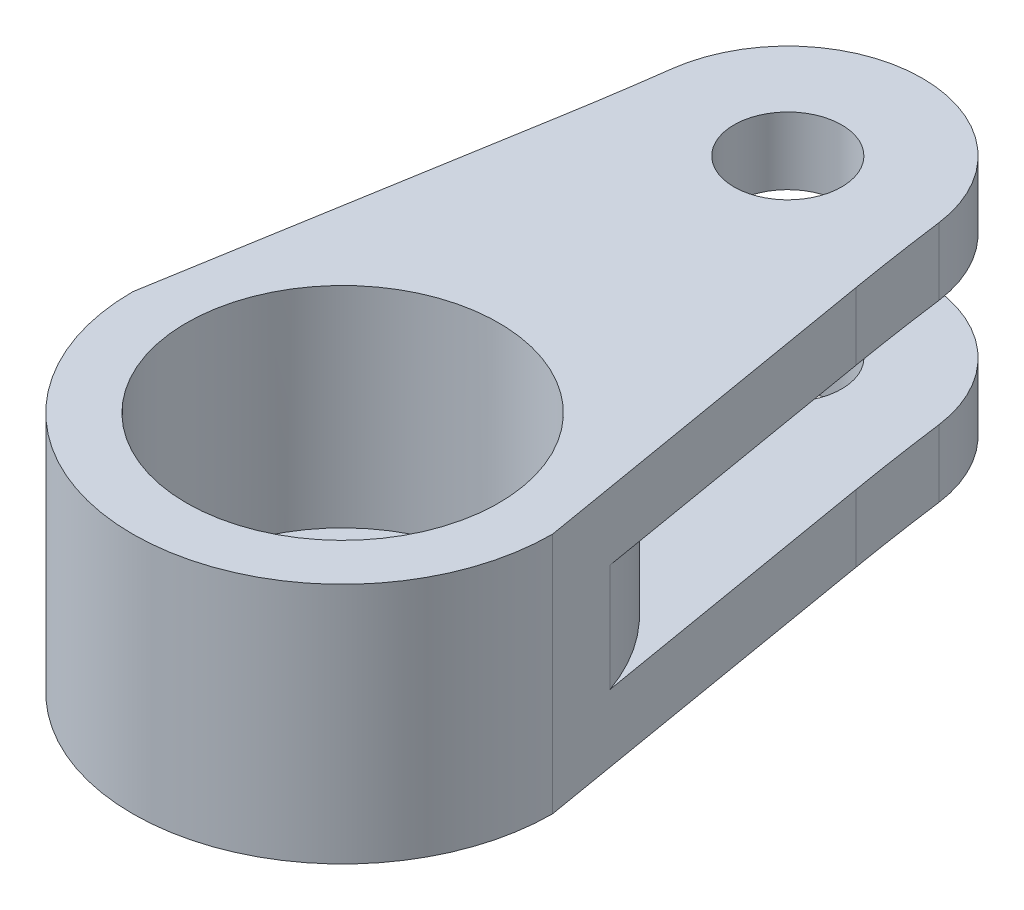
ISO-10303-21;
HEADER;
FILE_DESCRIPTION(('STEP AP214'),'2;1');
FILE_NAME('part.step','',(''),(''),'','','');
FILE_SCHEMA(('AUTOMOTIVE_DESIGN { 1 0 10303 214 1 1 1 1 }'));
ENDSEC;
DATA;
#1=APPLICATION_CONTEXT('core data for automotive mechanical design processes');
#2=APPLICATION_PROTOCOL_DEFINITION('international standard','automotive_design',2000,#1);
#3=PRODUCT_CONTEXT('',#1,'mechanical');
#4=PRODUCT('Part','Part','',(#3));
#5=PRODUCT_RELATED_PRODUCT_CATEGORY('part','',(#4));
#6=PRODUCT_DEFINITION_FORMATION('','',#4);
#7=PRODUCT_DEFINITION_CONTEXT('part definition',#1,'design');
#8=PRODUCT_DEFINITION('design','',#6,#7);
#9=PRODUCT_DEFINITION_SHAPE('','',#8);
#10=(LENGTH_UNIT() NAMED_UNIT(*) SI_UNIT(.MILLI.,.METRE.));
#11=(NAMED_UNIT(*) PLANE_ANGLE_UNIT() SI_UNIT($,.RADIAN.));
#12=(NAMED_UNIT(*) SI_UNIT($,.STERADIAN.) SOLID_ANGLE_UNIT());
#13=UNCERTAINTY_MEASURE_WITH_UNIT(LENGTH_MEASURE(1.E-05),#10,'distance_accuracy_value','');
#14=(GEOMETRIC_REPRESENTATION_CONTEXT(3) GLOBAL_UNCERTAINTY_ASSIGNED_CONTEXT((#13)) GLOBAL_UNIT_ASSIGNED_CONTEXT((#10,
#11,#12)) REPRESENTATION_CONTEXT('',''));
#15=CARTESIAN_POINT('',(0.,0.,0.));
#16=DIRECTION('',(0.,0.,1.));
#17=DIRECTION('',(1.,0.,0.));
#18=AXIS2_PLACEMENT_3D('',#15,#16,#17);
#19=CARTESIAN_POINT('',(0.,0.,0.));
#20=DIRECTION('',(0.,1.,0.));
#21=DIRECTION('',(0.,0.,1.));
#22=AXIS2_PLACEMENT_3D('',#19,#20,#21);
#23=CYLINDRICAL_SURFACE('',#22,2.9);
#24=CARTESIAN_POINT('',(0.,4.5,0.));
#25=DIRECTION('',(0.,1.,0.));
#26=DIRECTION('',(0.,0.,1.));
#27=AXIS2_PLACEMENT_3D('',#24,#25,#26);
#28=CIRCLE('',#27,2.9);
#29=CARTESIAN_POINT('',(0.,4.5,2.9));
#30=VERTEX_POINT('',#29);
#31=EDGE_CURVE('E196',#30,#30,#28,.T.);
#32=ORIENTED_EDGE('',*,*,#31,.T.);
#33=EDGE_LOOP('',(#32));
#34=FACE_BOUND('',#33,.T.);
#35=CARTESIAN_POINT('',(0.,0.6,0.));
#36=DIRECTION('',(0.,-1.,0.));
#37=DIRECTION('',(0.,0.,-1.));
#38=AXIS2_PLACEMENT_3D('',#35,#36,#37);
#39=CIRCLE('',#38,2.9);
#40=CARTESIAN_POINT('',(0.,0.6,-2.9));
#41=VERTEX_POINT('',#40);
#42=EDGE_CURVE('E11',#41,#41,#39,.F.);
#43=ORIENTED_EDGE('',*,*,#42,.F.);
#44=EDGE_LOOP('',(#43));
#45=FACE_BOUND('',#44,.T.);
#46=ADVANCED_FACE('F43',(#34,#45),#23,.F.);
#47=CARTESIAN_POINT('',(2.5,4.5,-8.27));
#48=DIRECTION('',(-0.985971831200907,0.,0.166911797301242));
#49=DIRECTION('',(0.166911797301242,0.,0.985971831200907));
#50=AXIS2_PLACEMENT_3D('',#47,#48,#49);
#51=PLANE('',#50);
#52=DIRECTION('',(-0.166911797301242,0.,-0.985971831200907));
#53=VECTOR('',#52,1.);
#54=CARTESIAN_POINT('',(3.68269552498902,1.25,-1.28364857738629));
#55=LINE('',#54,#53);
#56=CARTESIAN_POINT('',(3.68269552498902,1.25,-1.28364857738629));
#57=VERTEX_POINT('',#56);
#58=CARTESIAN_POINT('',(2.75059412488278,1.25,-6.7897047051567));
#59=VERTEX_POINT('',#58);
#60=EDGE_CURVE('E148',#57,#59,#55,.T.);
#61=ORIENTED_EDGE('',*,*,#60,.F.);
#62=DIRECTION('',(0.,1.,0.));
#63=VECTOR('',#62,1.);
#64=CARTESIAN_POINT('',(3.68269552498902,1.25,-1.28364857738629));
#65=LINE('',#64,#63);
#66=CARTESIAN_POINT('',(3.68269552498902,3.25,-1.28364857738629));
#67=VERTEX_POINT('',#66);
#68=EDGE_CURVE('E134',#57,#67,#65,.T.);
#69=ORIENTED_EDGE('',*,*,#68,.T.);
#70=DIRECTION('',(-0.166911797301242,0.,-0.985971831200907));
#71=VECTOR('',#70,1.);
#72=CARTESIAN_POINT('',(3.68269552498902,3.25,-1.28364857738629));
#73=LINE('',#72,#71);
#74=CARTESIAN_POINT('',(2.75059412488278,3.25,-6.7897047051567));
#75=VERTEX_POINT('',#74);
#76=EDGE_CURVE('E177',#67,#75,#73,.T.);
#77=ORIENTED_EDGE('',*,*,#76,.T.);
#78=DIRECTION('',(0.,1.,0.));
#79=VECTOR('',#78,1.);
#80=CARTESIAN_POINT('',(2.75059412488278,4.5,-6.78970470515671));
#81=LINE('',#80,#79);
#82=CARTESIAN_POINT('',(2.75059412488278,4.5,-6.78970470515671));
#83=VERTEX_POINT('',#82);
#84=EDGE_CURVE('E67',#75,#83,#81,.T.);
#85=ORIENTED_EDGE('',*,*,#84,.T.);
#86=DIRECTION('',(-0.166911797301242,0.,-0.985971831200907));
#87=VECTOR('',#86,1.);
#88=CARTESIAN_POINT('',(2.5,4.5,-8.27));
#89=LINE('',#88,#87);
#90=CARTESIAN_POINT('',(3.9,4.5,0.));
#91=VERTEX_POINT('',#90);
#92=EDGE_CURVE('E212',#91,#83,#89,.T.);
#93=ORIENTED_EDGE('',*,*,#92,.F.);
#94=DIRECTION('',(0.,-1.,0.));
#95=VECTOR('',#94,1.);
#96=CARTESIAN_POINT('',(3.9,4.5,0.));
#97=LINE('',#96,#95);
#98=CARTESIAN_POINT('',(3.9,0.,0.));
#99=VERTEX_POINT('',#98);
#100=EDGE_CURVE('E239',#91,#99,#97,.T.);
#101=ORIENTED_EDGE('',*,*,#100,.T.);
#102=DIRECTION('',(-0.166911797301242,0.,-0.985971831200907));
#103=VECTOR('',#102,1.);
#104=CARTESIAN_POINT('',(2.5,0.,-8.27));
#105=LINE('',#104,#103);
#106=CARTESIAN_POINT('',(2.75059412488278,0.,-6.78970470515671));
#107=VERTEX_POINT('',#106);
#108=EDGE_CURVE('E227',#99,#107,#105,.T.);
#109=ORIENTED_EDGE('',*,*,#108,.T.);
#110=EDGE_CURVE('E159',#107,#59,#81,.T.);
#111=ORIENTED_EDGE('',*,*,#110,.T.);
#112=EDGE_LOOP('',(#61,#69,#77,#85,#93,#101,#109,#111));
#113=FACE_BOUND('',#112,.T.);
#114=ADVANCED_FACE('F156',(#113),#51,.F.);
#115=CARTESIAN_POINT('',(0.,4.5,-8.27));
#116=DIRECTION('',(0.,-1.,0.));
#117=DIRECTION('',(0.,0.,-1.));
#118=AXIS2_PLACEMENT_3D('',#115,#116,#117);
#119=CYLINDRICAL_SURFACE('',#118,2.5);
#120=CARTESIAN_POINT('',(0.,1.25,-8.27));
#121=DIRECTION('',(0.,1.,0.));
#122=DIRECTION('',(0.,0.,1.));
#123=AXIS2_PLACEMENT_3D('',#120,#121,#122);
#124=CIRCLE('',#123,2.5);
#125=CARTESIAN_POINT('',(2.47853265166325,1.25,-8.59691878905806));
#126=VERTEX_POINT('',#125);
#127=CARTESIAN_POINT('',(-2.47853265166324,1.25,-8.59691878905804));
#128=VERTEX_POINT('',#127);
#129=EDGE_CURVE('E164',#126,#128,#124,.T.);
#130=ORIENTED_EDGE('',*,*,#129,.F.);
#131=DIRECTION('',(0.,-1.,0.));
#132=VECTOR('',#131,1.);
#133=CARTESIAN_POINT('',(2.47853265166324,4.5,-8.59691878905804));
#134=LINE('',#133,#132);
#135=CARTESIAN_POINT('',(2.47853265166324,0.,-8.59691878905804));
#136=VERTEX_POINT('',#135);
#137=EDGE_CURVE('E248',#126,#136,#134,.T.);
#138=ORIENTED_EDGE('',*,*,#137,.T.);
#139=CARTESIAN_POINT('',(0.,0.,-8.27));
#140=DIRECTION('',(0.,1.,0.));
#141=DIRECTION('',(0.,0.,1.));
#142=AXIS2_PLACEMENT_3D('',#139,#140,#141);
#143=CIRCLE('',#142,2.5);
#144=CARTESIAN_POINT('',(-2.47853265166324,0.,-8.59691878905804));
#145=VERTEX_POINT('',#144);
#146=EDGE_CURVE('E230',#136,#145,#143,.T.);
#147=ORIENTED_EDGE('',*,*,#146,.T.);
#148=DIRECTION('',(0.,-1.,0.));
#149=VECTOR('',#148,1.);
#150=CARTESIAN_POINT('',(-2.47853265166324,4.5,-8.59691878905804));
#151=LINE('',#150,#149);
#152=EDGE_CURVE('E254',#145,#128,#151,.F.);
#153=ORIENTED_EDGE('',*,*,#152,.T.);
#154=EDGE_LOOP('',(#130,#138,#147,#153));
#155=FACE_BOUND('',#154,.T.);
#156=ADVANCED_FACE('F313',(#155),#119,.T.);
#157=CARTESIAN_POINT('',(-3.9,4.5,0.));
#158=DIRECTION('',(0.985971831200907,0.,0.166911797301242));
#159=DIRECTION('',(0.166911797301242,0.,-0.985971831200907));
#160=AXIS2_PLACEMENT_3D('',#157,#158,#159);
#161=PLANE('',#160);
#162=DIRECTION('',(-0.166911797301243,0.,0.985971831200906));
#163=VECTOR('',#162,1.);
#164=CARTESIAN_POINT('',(-2.75059412488278,1.25,-6.78970470515668));
#165=LINE('',#164,#163);
#166=CARTESIAN_POINT('',(-2.75059412488278,1.25,-6.78970470515668));
#167=VERTEX_POINT('',#166);
#168=CARTESIAN_POINT('',(-3.68269552498902,1.25,-1.28364857738629));
#169=VERTEX_POINT('',#168);
#170=EDGE_CURVE('E144',#167,#169,#165,.T.);
#171=ORIENTED_EDGE('',*,*,#170,.F.);
#172=DIRECTION('',(0.,1.,0.));
#173=VECTOR('',#172,1.);
#174=CARTESIAN_POINT('',(-2.75059412488278,0.,-6.78970470515671));
#175=LINE('',#174,#173);
#176=CARTESIAN_POINT('',(-2.75059412488278,0.,-6.78970470515671));
#177=VERTEX_POINT('',#176);
#178=EDGE_CURVE('E243',#167,#177,#175,.F.);
#179=ORIENTED_EDGE('',*,*,#178,.T.);
#180=DIRECTION('',(-0.166911797301242,0.,0.985971831200907));
#181=VECTOR('',#180,1.);
#182=CARTESIAN_POINT('',(-3.9,0.,0.));
#183=LINE('',#182,#181);
#184=CARTESIAN_POINT('',(-3.9,0.,0.));
#185=VERTEX_POINT('',#184);
#186=EDGE_CURVE('E213',#177,#185,#183,.T.);
#187=ORIENTED_EDGE('',*,*,#186,.T.);
#188=DIRECTION('',(0.,-1.,0.));
#189=VECTOR('',#188,1.);
#190=CARTESIAN_POINT('',(-3.9,4.5,0.));
#191=LINE('',#190,#189);
#192=CARTESIAN_POINT('',(-3.9,4.5,0.));
#193=VERTEX_POINT('',#192);
#194=EDGE_CURVE('E223',#193,#185,#191,.T.);
#195=ORIENTED_EDGE('',*,*,#194,.F.);
#196=DIRECTION('',(-0.166911797301242,0.,0.985971831200907));
#197=VECTOR('',#196,1.);
#198=CARTESIAN_POINT('',(-3.9,4.5,0.));
#199=LINE('',#198,#197);
#200=CARTESIAN_POINT('',(-2.75059412488278,4.5,-6.78970470515671));
#201=VERTEX_POINT('',#200);
#202=EDGE_CURVE('E220',#201,#193,#199,.T.);
#203=ORIENTED_EDGE('',*,*,#202,.F.);
#204=CARTESIAN_POINT('',(-2.75059412488278,3.25,-6.78970470515668));
#205=VERTEX_POINT('',#204);
#206=EDGE_CURVE('E244',#201,#205,#175,.F.);
#207=ORIENTED_EDGE('',*,*,#206,.T.);
#208=DIRECTION('',(-0.166911797301243,0.,0.985971831200906));
#209=VECTOR('',#208,1.);
#210=CARTESIAN_POINT('',(-2.75059412488278,3.25,-6.78970470515668));
#211=LINE('',#210,#209);
#212=CARTESIAN_POINT('',(-3.68269552498902,3.25,-1.28364857738629));
#213=VERTEX_POINT('',#212);
#214=EDGE_CURVE('E153',#205,#213,#211,.T.);
#215=ORIENTED_EDGE('',*,*,#214,.T.);
#216=DIRECTION('',(0.,1.,0.));
#217=VECTOR('',#216,1.);
#218=CARTESIAN_POINT('',(-3.68269552498902,1.25,-1.28364857738629));
#219=LINE('',#218,#217);
#220=EDGE_CURVE('E143',#169,#213,#219,.T.);
#221=ORIENTED_EDGE('',*,*,#220,.F.);
#222=EDGE_LOOP('',(#171,#179,#187,#195,#203,#207,#215,#221));
#223=FACE_BOUND('',#222,.T.);
#224=ADVANCED_FACE('F281',(#223),#161,.F.);
#225=CARTESIAN_POINT('',(0.,0.,-8.27));
#226=DIRECTION('',(0.,1.,0.));
#227=DIRECTION('',(0.,0.,1.));
#228=AXIS2_PLACEMENT_3D('',#225,#226,#227);
#229=CYLINDRICAL_SURFACE('',#228,1.);
#230=CARTESIAN_POINT('',(0.,0.,-8.27));
#231=DIRECTION('',(0.,1.,0.));
#232=DIRECTION('',(0.,0.,1.));
#233=AXIS2_PLACEMENT_3D('',#230,#231,#232);
#234=CIRCLE('',#233,1.);
#235=CARTESIAN_POINT('',(0.,0.,-7.27));
#236=VERTEX_POINT('',#235);
#237=EDGE_CURVE('E194',#236,#236,#234,.T.);
#238=ORIENTED_EDGE('',*,*,#237,.F.);
#239=EDGE_LOOP('',(#238));
#240=FACE_BOUND('',#239,.T.);
#241=CARTESIAN_POINT('',(0.,1.25,-8.27));
#242=DIRECTION('',(0.,1.,0.));
#243=DIRECTION('',(0.,0.,1.));
#244=AXIS2_PLACEMENT_3D('',#241,#242,#243);
#245=CIRCLE('',#244,1.);
#246=CARTESIAN_POINT('',(0.,1.25,-7.27));
#247=VERTEX_POINT('',#246);
#248=EDGE_CURVE('E178',#247,#247,#245,.T.);
#249=ORIENTED_EDGE('',*,*,#248,.T.);
#250=EDGE_LOOP('',(#249));
#251=FACE_BOUND('',#250,.T.);
#252=ADVANCED_FACE('F320',(#240,#251),#229,.F.);
#253=CARTESIAN_POINT('',(-52.0491856849281,4.5,-15.1352945702188));
#254=DIRECTION('',(0.,-1.,0.));
#255=DIRECTION('',(0.,0.,-1.));
#256=AXIS2_PLACEMENT_3D('',#253,#254,#255);
#257=CYLINDRICAL_SURFACE('',#256,50.);
#258=CARTESIAN_POINT('',(-52.0491856849281,1.25,-15.1352945702188));
#259=DIRECTION('',(0.,-1.,0.));
#260=DIRECTION('',(0.,0.,1.));
#261=AXIS2_PLACEMENT_3D('',#258,#259,#260);
#262=CIRCLE('',#261,50.);
#263=EDGE_CURVE('E170',#128,#167,#262,.T.);
#264=ORIENTED_EDGE('',*,*,#263,.F.);
#265=ORIENTED_EDGE('',*,*,#152,.F.);
#266=CARTESIAN_POINT('',(-52.0491856849281,0.,-15.1352945702188));
#267=DIRECTION('',(0.,1.,0.));
#268=DIRECTION('',(0.,0.,1.));
#269=AXIS2_PLACEMENT_3D('',#266,#267,#268);
#270=CIRCLE('',#269,50.);
#271=EDGE_CURVE('E260',#177,#145,#270,.T.);
#272=ORIENTED_EDGE('',*,*,#271,.F.);
#273=ORIENTED_EDGE('',*,*,#178,.F.);
#274=EDGE_LOOP('',(#264,#265,#272,#273));
#275=FACE_BOUND('',#274,.T.);
#276=ADVANCED_FACE('F297',(#275),#257,.F.);
#277=CARTESIAN_POINT('',(52.0491856849281,4.5,-15.1352945702188));
#278=DIRECTION('',(0.,-1.,0.));
#279=DIRECTION('',(0.,0.,-1.));
#280=AXIS2_PLACEMENT_3D('',#277,#278,#279);
#281=CYLINDRICAL_SURFACE('',#280,50.);
#282=CARTESIAN_POINT('',(52.0491856849281,1.25,-15.1352945702188));
#283=DIRECTION('',(0.,-1.,0.));
#284=DIRECTION('',(0.,0.,1.));
#285=AXIS2_PLACEMENT_3D('',#282,#283,#284);
#286=CIRCLE('',#285,50.);
#287=EDGE_CURVE('E161',#59,#126,#286,.T.);
#288=ORIENTED_EDGE('',*,*,#287,.F.);
#289=ORIENTED_EDGE('',*,*,#110,.F.);
#290=CARTESIAN_POINT('',(52.0491856849281,0.,-15.1352945702188));
#291=DIRECTION('',(0.,1.,0.));
#292=DIRECTION('',(0.,0.,1.));
#293=AXIS2_PLACEMENT_3D('',#290,#291,#292);
#294=CIRCLE('',#293,50.);
#295=EDGE_CURVE('E266',#136,#107,#294,.T.);
#296=ORIENTED_EDGE('',*,*,#295,.F.);
#297=ORIENTED_EDGE('',*,*,#137,.F.);
#298=EDGE_LOOP('',(#288,#289,#296,#297));
#299=FACE_BOUND('',#298,.T.);
#300=ADVANCED_FACE('F309',(#299),#281,.F.);
#301=CARTESIAN_POINT('',(0.,4.5,0.));
#302=DIRECTION('',(0.,-1.,0.));
#303=DIRECTION('',(0.,0.,-1.));
#304=AXIS2_PLACEMENT_3D('',#301,#302,#303);
#305=CYLINDRICAL_SURFACE('',#304,3.9);
#306=CARTESIAN_POINT('',(0.,0.,0.));
#307=DIRECTION('',(0.,1.,0.));
#308=DIRECTION('',(0.,0.,1.));
#309=AXIS2_PLACEMENT_3D('',#306,#307,#308);
#310=CIRCLE('',#309,3.9);
#311=EDGE_CURVE('E200',#185,#99,#310,.T.);
#312=ORIENTED_EDGE('',*,*,#311,.T.);
#313=ORIENTED_EDGE('',*,*,#100,.F.);
#314=CARTESIAN_POINT('',(0.,4.5,0.));
#315=DIRECTION('',(0.,1.,0.));
#316=DIRECTION('',(0.,0.,1.));
#317=AXIS2_PLACEMENT_3D('',#314,#315,#316);
#318=CIRCLE('',#317,3.9);
#319=EDGE_CURVE('E208',#193,#91,#318,.T.);
#320=ORIENTED_EDGE('',*,*,#319,.F.);
#321=ORIENTED_EDGE('',*,*,#194,.T.);
#322=EDGE_LOOP('',(#312,#313,#320,#321));
#323=FACE_BOUND('',#322,.T.);
#324=ADVANCED_FACE('F305',(#323),#305,.T.);
#325=CARTESIAN_POINT('',(2.47853265166324,4.5,-8.59691878905804));
#326=VERTEX_POINT('',#325);
#327=CARTESIAN_POINT('',(2.47853265166324,3.25,-8.59691878905804));
#328=VERTEX_POINT('',#327);
#329=EDGE_CURVE('E249',#326,#328,#134,.T.);
#330=ORIENTED_EDGE('',*,*,#329,.T.);
#331=CARTESIAN_POINT('',(0.,3.25,-8.27));
#332=DIRECTION('',(0.,1.,0.));
#333=DIRECTION('',(0.,0.,1.));
#334=AXIS2_PLACEMENT_3D('',#331,#332,#333);
#335=CIRCLE('',#334,2.5);
#336=CARTESIAN_POINT('',(-2.47853265166324,3.25,-8.59691878905804));
#337=VERTEX_POINT('',#336);
#338=EDGE_CURVE('E59',#328,#337,#335,.T.);
#339=ORIENTED_EDGE('',*,*,#338,.T.);
#340=CARTESIAN_POINT('',(-2.47853265166324,4.5,-8.59691878905804));
#341=VERTEX_POINT('',#340);
#342=EDGE_CURVE('E253',#337,#341,#151,.F.);
#343=ORIENTED_EDGE('',*,*,#342,.T.);
#344=CARTESIAN_POINT('',(0.,4.5,-8.27));
#345=DIRECTION('',(0.,1.,0.));
#346=DIRECTION('',(0.,0.,1.));
#347=AXIS2_PLACEMENT_3D('',#344,#345,#346);
#348=CIRCLE('',#347,2.5);
#349=EDGE_CURVE('E216',#326,#341,#348,.T.);
#350=ORIENTED_EDGE('',*,*,#349,.F.);
#351=EDGE_LOOP('',(#330,#339,#343,#350));
#352=FACE_BOUND('',#351,.T.);
#353=ADVANCED_FACE('F277',(#352),#119,.T.);
#354=CARTESIAN_POINT('',(0.,4.5,0.));
#355=DIRECTION('',(0.,1.,0.));
#356=DIRECTION('',(0.,0.,1.));
#357=AXIS2_PLACEMENT_3D('',#354,#355,#356);
#358=PLANE('',#357);
#359=ORIENTED_EDGE('',*,*,#31,.F.);
#360=EDGE_LOOP('',(#359));
#361=FACE_BOUND('',#360,.T.);
#362=CARTESIAN_POINT('',(0.,4.5,-8.27));
#363=DIRECTION('',(0.,1.,0.));
#364=DIRECTION('',(0.,0.,1.));
#365=AXIS2_PLACEMENT_3D('',#362,#363,#364);
#366=CIRCLE('',#365,1.);
#367=CARTESIAN_POINT('',(0.,4.5,-7.27));
#368=VERTEX_POINT('',#367);
#369=EDGE_CURVE('E201',#368,#368,#366,.T.);
#370=ORIENTED_EDGE('',*,*,#369,.F.);
#371=EDGE_LOOP('',(#370));
#372=FACE_BOUND('',#371,.T.);
#373=ORIENTED_EDGE('',*,*,#319,.T.);
#374=ORIENTED_EDGE('',*,*,#92,.T.);
#375=CARTESIAN_POINT('',(52.0491856849281,4.5,-15.1352945702188));
#376=DIRECTION('',(0.,1.,0.));
#377=DIRECTION('',(0.,0.,1.));
#378=AXIS2_PLACEMENT_3D('',#375,#376,#377);
#379=CIRCLE('',#378,50.);
#380=EDGE_CURVE('E52',#83,#326,#379,.F.);
#381=ORIENTED_EDGE('',*,*,#380,.T.);
#382=ORIENTED_EDGE('',*,*,#349,.T.);
#383=CARTESIAN_POINT('',(-52.0491856849281,4.5,-15.1352945702188));
#384=DIRECTION('',(0.,1.,0.));
#385=DIRECTION('',(0.,0.,1.));
#386=AXIS2_PLACEMENT_3D('',#383,#384,#385);
#387=CIRCLE('',#386,50.);
#388=EDGE_CURVE('E263',#341,#201,#387,.F.);
#389=ORIENTED_EDGE('',*,*,#388,.T.);
#390=ORIENTED_EDGE('',*,*,#202,.T.);
#391=EDGE_LOOP('',(#373,#374,#381,#382,#389,#390));
#392=FACE_BOUND('',#391,.T.);
#393=ADVANCED_FACE('F272',(#361,#372,#392),#358,.T.);
#394=CARTESIAN_POINT('',(0.,0.,0.));
#395=DIRECTION('',(0.,1.,0.));
#396=DIRECTION('',(0.,0.,1.));
#397=AXIS2_PLACEMENT_3D('',#394,#395,#396);
#398=PLANE('',#397);
#399=ORIENTED_EDGE('',*,*,#237,.T.);
#400=EDGE_LOOP('',(#399));
#401=FACE_BOUND('',#400,.T.);
#402=ORIENTED_EDGE('',*,*,#311,.F.);
#403=ORIENTED_EDGE('',*,*,#186,.F.);
#404=ORIENTED_EDGE('',*,*,#271,.T.);
#405=ORIENTED_EDGE('',*,*,#146,.F.);
#406=ORIENTED_EDGE('',*,*,#295,.T.);
#407=ORIENTED_EDGE('',*,*,#108,.F.);
#408=EDGE_LOOP('',(#402,#403,#404,#405,#406,#407));
#409=FACE_BOUND('',#408,.T.);
#410=CARTESIAN_POINT('',(0.,0.,0.));
#411=DIRECTION('',(0.,-1.,0.));
#412=DIRECTION('',(0.,0.,-1.));
#413=AXIS2_PLACEMENT_3D('',#410,#411,#412);
#414=CIRCLE('',#413,1.5);
#415=CARTESIAN_POINT('',(0.,0.,-1.5));
#416=VERTEX_POINT('',#415);
#417=EDGE_CURVE('E361',#416,#416,#414,.T.);
#418=ORIENTED_EDGE('',*,*,#417,.F.);
#419=EDGE_LOOP('',(#418));
#420=FACE_BOUND('',#419,.T.);
#421=ADVANCED_FACE('F301',(#401,#409,#420),#398,.F.);
#422=CARTESIAN_POINT('',(0.,3.25,-8.27));
#423=DIRECTION('',(0.,1.,0.));
#424=DIRECTION('',(0.,0.,1.));
#425=AXIS2_PLACEMENT_3D('',#422,#423,#424);
#426=CIRCLE('',#425,1.);
#427=CARTESIAN_POINT('',(0.,3.25,-7.27));
#428=VERTEX_POINT('',#427);
#429=EDGE_CURVE('E355',#428,#428,#426,.T.);
#430=ORIENTED_EDGE('',*,*,#429,.F.);
#431=EDGE_LOOP('',(#430));
#432=FACE_BOUND('',#431,.T.);
#433=ORIENTED_EDGE('',*,*,#369,.T.);
#434=EDGE_LOOP('',(#433));
#435=FACE_BOUND('',#434,.T.);
#436=ADVANCED_FACE('F335',(#432,#435),#229,.F.);
#437=ORIENTED_EDGE('',*,*,#342,.F.);
#438=CARTESIAN_POINT('',(-52.0491856849281,3.25,-15.1352945702188));
#439=DIRECTION('',(0.,-1.,0.));
#440=DIRECTION('',(0.,0.,1.));
#441=AXIS2_PLACEMENT_3D('',#438,#439,#440);
#442=CIRCLE('',#441,50.);
#443=EDGE_CURVE('E186',#337,#205,#442,.T.);
#444=ORIENTED_EDGE('',*,*,#443,.T.);
#445=ORIENTED_EDGE('',*,*,#206,.F.);
#446=ORIENTED_EDGE('',*,*,#388,.F.);
#447=EDGE_LOOP('',(#437,#444,#445,#446));
#448=FACE_BOUND('',#447,.T.);
#449=ADVANCED_FACE('F286',(#448),#257,.F.);
#450=ORIENTED_EDGE('',*,*,#84,.F.);
#451=CARTESIAN_POINT('',(52.0491856849281,3.25,-15.1352945702188));
#452=DIRECTION('',(0.,-1.,0.));
#453=DIRECTION('',(0.,0.,1.));
#454=AXIS2_PLACEMENT_3D('',#451,#452,#453);
#455=CIRCLE('',#454,50.);
#456=EDGE_CURVE('E181',#75,#328,#455,.T.);
#457=ORIENTED_EDGE('',*,*,#456,.T.);
#458=ORIENTED_EDGE('',*,*,#329,.F.);
#459=ORIENTED_EDGE('',*,*,#380,.F.);
#460=EDGE_LOOP('',(#450,#457,#458,#459));
#461=FACE_BOUND('',#460,.T.);
#462=ADVANCED_FACE('F45',(#461),#281,.F.);
#463=CARTESIAN_POINT('',(0.,1.25,0.));
#464=DIRECTION('',(0.,1.,0.));
#465=DIRECTION('',(0.,0.,1.));
#466=AXIS2_PLACEMENT_3D('',#463,#464,#465);
#467=CYLINDRICAL_SURFACE('',#466,3.9);
#468=CARTESIAN_POINT('',(0.,3.25,0.));
#469=DIRECTION('',(0.,-1.,0.));
#470=DIRECTION('',(0.,0.,1.));
#471=AXIS2_PLACEMENT_3D('',#468,#469,#470);
#472=CIRCLE('',#471,3.9);
#473=EDGE_CURVE('E140',#213,#67,#472,.T.);
#474=ORIENTED_EDGE('',*,*,#473,.T.);
#475=ORIENTED_EDGE('',*,*,#68,.F.);
#476=CARTESIAN_POINT('',(0.,1.25,0.));
#477=DIRECTION('',(0.,-1.,0.));
#478=DIRECTION('',(0.,0.,1.));
#479=AXIS2_PLACEMENT_3D('',#476,#477,#478);
#480=CIRCLE('',#479,3.9);
#481=EDGE_CURVE('E137',#169,#57,#480,.T.);
#482=ORIENTED_EDGE('',*,*,#481,.F.);
#483=ORIENTED_EDGE('',*,*,#220,.T.);
#484=EDGE_LOOP('',(#474,#475,#482,#483));
#485=FACE_BOUND('',#484,.T.);
#486=ADVANCED_FACE('F136',(#485),#467,.T.);
#487=CARTESIAN_POINT('',(0.,1.25,0.));
#488=DIRECTION('',(0.,1.,0.));
#489=DIRECTION('',(0.,0.,1.));
#490=AXIS2_PLACEMENT_3D('',#487,#488,#489);
#491=PLANE('',#490);
#492=ORIENTED_EDGE('',*,*,#248,.F.);
#493=EDGE_LOOP('',(#492));
#494=FACE_BOUND('',#493,.T.);
#495=ORIENTED_EDGE('',*,*,#481,.T.);
#496=ORIENTED_EDGE('',*,*,#60,.T.);
#497=ORIENTED_EDGE('',*,*,#287,.T.);
#498=ORIENTED_EDGE('',*,*,#129,.T.);
#499=ORIENTED_EDGE('',*,*,#263,.T.);
#500=ORIENTED_EDGE('',*,*,#170,.T.);
#501=EDGE_LOOP('',(#495,#496,#497,#498,#499,#500));
#502=FACE_BOUND('',#501,.T.);
#503=ADVANCED_FACE('F147',(#494,#502),#491,.T.);
#504=CARTESIAN_POINT('',(0.,3.25,0.));
#505=DIRECTION('',(0.,1.,0.));
#506=DIRECTION('',(0.,0.,1.));
#507=AXIS2_PLACEMENT_3D('',#504,#505,#506);
#508=PLANE('',#507);
#509=ORIENTED_EDGE('',*,*,#429,.T.);
#510=EDGE_LOOP('',(#509));
#511=FACE_BOUND('',#510,.T.);
#512=ORIENTED_EDGE('',*,*,#473,.F.);
#513=ORIENTED_EDGE('',*,*,#214,.F.);
#514=ORIENTED_EDGE('',*,*,#443,.F.);
#515=ORIENTED_EDGE('',*,*,#338,.F.);
#516=ORIENTED_EDGE('',*,*,#456,.F.);
#517=ORIENTED_EDGE('',*,*,#76,.F.);
#518=EDGE_LOOP('',(#512,#513,#514,#515,#516,#517));
#519=FACE_BOUND('',#518,.T.);
#520=ADVANCED_FACE('F279',(#511,#519),#508,.F.);
#521=CARTESIAN_POINT('',(0.,0.6,0.));
#522=DIRECTION('',(0.,-1.,0.));
#523=DIRECTION('',(0.,0.,-1.));
#524=AXIS2_PLACEMENT_3D('',#521,#522,#523);
#525=PLANE('',#524);
#526=CARTESIAN_POINT('',(0.,0.6,0.));
#527=DIRECTION('',(0.,-1.,0.));
#528=DIRECTION('',(0.,0.,-1.));
#529=AXIS2_PLACEMENT_3D('',#526,#527,#528);
#530=CIRCLE('',#529,1.5);
#531=CARTESIAN_POINT('',(0.,0.6,-1.5));
#532=VERTEX_POINT('',#531);
#533=EDGE_CURVE('E359',#532,#532,#530,.T.);
#534=ORIENTED_EDGE('',*,*,#533,.T.);
#535=EDGE_LOOP('',(#534));
#536=FACE_BOUND('',#535,.T.);
#537=ORIENTED_EDGE('',*,*,#42,.T.);
#538=EDGE_LOOP('',(#537));
#539=FACE_BOUND('',#538,.T.);
#540=ADVANCED_FACE('F369',(#536,#539),#525,.F.);
#541=CARTESIAN_POINT('',(0.,0.6,0.));
#542=DIRECTION('',(0.,-1.,0.));
#543=DIRECTION('',(0.,0.,-1.));
#544=AXIS2_PLACEMENT_3D('',#541,#542,#543);
#545=CYLINDRICAL_SURFACE('',#544,1.5);
#546=ORIENTED_EDGE('',*,*,#533,.F.);
#547=EDGE_LOOP('',(#546));
#548=FACE_BOUND('',#547,.T.);
#549=ORIENTED_EDGE('',*,*,#417,.T.);
#550=EDGE_LOOP('',(#549));
#551=FACE_BOUND('',#550,.T.);
#552=ADVANCED_FACE('F372',(#548,#551),#545,.F.);
#553=CLOSED_SHELL('',(#46,#114,#156,#224,#252,#276,#300,#324,#353,#393,#421,#436,#449,#462,#486,
#503,#520,#540,#552));
#554=MANIFOLD_SOLID_BREP('B2',#553);
#555=ADVANCED_BREP_SHAPE_REPRESENTATION('',(#18,#554),#14);
#556=SHAPE_DEFINITION_REPRESENTATION(#9,#555);
ENDSEC;
END-ISO-10303-21;
